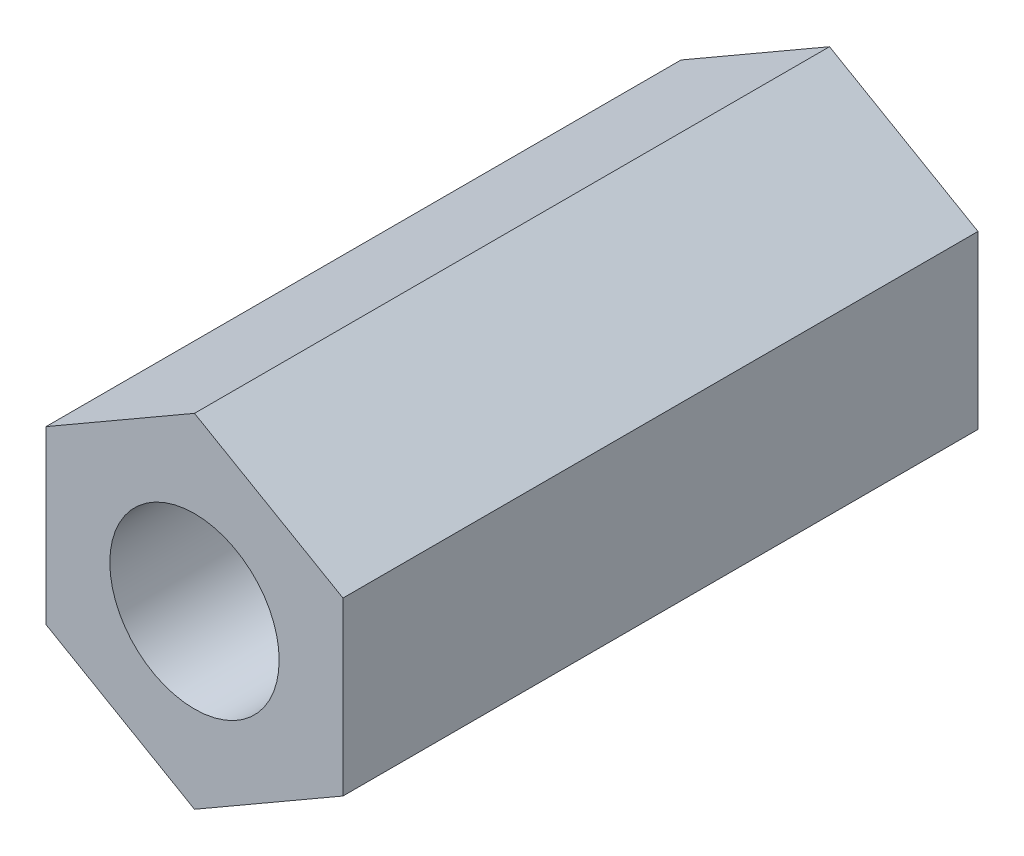
ISO-10303-21;
HEADER;
FILE_DESCRIPTION(('STEP AP214'),'2;1');
FILE_NAME('part.step','',(''),(''),'','','');
FILE_SCHEMA(('AUTOMOTIVE_DESIGN { 1 0 10303 214 1 1 1 1 }'));
ENDSEC;
DATA;
#1=APPLICATION_CONTEXT('core data for automotive mechanical design processes');
#2=APPLICATION_PROTOCOL_DEFINITION('international standard','automotive_design',2000,#1);
#3=PRODUCT_CONTEXT('',#1,'mechanical');
#4=PRODUCT('Part','Part','',(#3));
#5=PRODUCT_RELATED_PRODUCT_CATEGORY('part','',(#4));
#6=PRODUCT_DEFINITION_FORMATION('','',#4);
#7=PRODUCT_DEFINITION_CONTEXT('part definition',#1,'design');
#8=PRODUCT_DEFINITION('design','',#6,#7);
#9=PRODUCT_DEFINITION_SHAPE('','',#8);
#10=(LENGTH_UNIT() NAMED_UNIT(*) SI_UNIT(.MILLI.,.METRE.));
#11=(NAMED_UNIT(*) PLANE_ANGLE_UNIT() SI_UNIT($,.RADIAN.));
#12=(NAMED_UNIT(*) SI_UNIT($,.STERADIAN.) SOLID_ANGLE_UNIT());
#13=UNCERTAINTY_MEASURE_WITH_UNIT(LENGTH_MEASURE(1.E-05),#10,'distance_accuracy_value','');
#14=(GEOMETRIC_REPRESENTATION_CONTEXT(3) GLOBAL_UNCERTAINTY_ASSIGNED_CONTEXT((#13)) GLOBAL_UNIT_ASSIGNED_CONTEXT((#10,
#11,#12)) REPRESENTATION_CONTEXT('',''));
#15=CARTESIAN_POINT('',(0.,0.,0.));
#16=DIRECTION('',(0.,0.,1.));
#17=DIRECTION('',(1.,0.,0.));
#18=AXIS2_PLACEMENT_3D('',#15,#16,#17);
#19=CARTESIAN_POINT('',(1.75370144266349,3.0375,15.));
#20=DIRECTION('',(-0.5,-0.866025403784439,0.));
#21=DIRECTION('',(0.866025403784439,-0.5,0.));
#22=AXIS2_PLACEMENT_3D('',#19,#20,#21);
#23=PLANE('',#22);
#24=DIRECTION('',(-0.866025403784439,0.5,0.));
#25=VECTOR('',#24,1.);
#26=CARTESIAN_POINT('',(1.75370144266349,3.0375,0.));
#27=LINE('',#26,#25);
#28=CARTESIAN_POINT('',(3.50740288532697,2.025,0.));
#29=VERTEX_POINT('',#28);
#30=CARTESIAN_POINT('',(0.,4.05,0.));
#31=VERTEX_POINT('',#30);
#32=EDGE_CURVE('E131',#29,#31,#27,.T.);
#33=ORIENTED_EDGE('',*,*,#32,.T.);
#34=DIRECTION('',(0.,0.,-1.));
#35=VECTOR('',#34,1.);
#36=CARTESIAN_POINT('',(0.,4.05,15.));
#37=LINE('',#36,#35);
#38=CARTESIAN_POINT('',(0.,4.05,15.));
#39=VERTEX_POINT('',#38);
#40=EDGE_CURVE('E11',#39,#31,#37,.T.);
#41=ORIENTED_EDGE('',*,*,#40,.F.);
#42=DIRECTION('',(-0.866025403784439,0.5,0.));
#43=VECTOR('',#42,1.);
#44=CARTESIAN_POINT('',(1.75370144266349,3.0375,15.));
#45=LINE('',#44,#43);
#46=CARTESIAN_POINT('',(3.50740288532697,2.025,15.));
#47=VERTEX_POINT('',#46);
#48=EDGE_CURVE('E144',#47,#39,#45,.T.);
#49=ORIENTED_EDGE('',*,*,#48,.F.);
#50=DIRECTION('',(0.,0.,-1.));
#51=VECTOR('',#50,1.);
#52=CARTESIAN_POINT('',(3.50740288532697,2.025,15.));
#53=LINE('',#52,#51);
#54=EDGE_CURVE('E130',#47,#29,#53,.T.);
#55=ORIENTED_EDGE('',*,*,#54,.T.);
#56=EDGE_LOOP('',(#33,#41,#49,#55));
#57=FACE_BOUND('',#56,.T.);
#58=ADVANCED_FACE('F43',(#57),#23,.F.);
#59=CARTESIAN_POINT('',(-1.75370144266348,3.0375,15.));
#60=DIRECTION('',(0.499999999999999,-0.866025403784439,0.));
#61=DIRECTION('',(0.866025403784439,0.499999999999999,0.));
#62=AXIS2_PLACEMENT_3D('',#59,#60,#61);
#63=PLANE('',#62);
#64=DIRECTION('',(-0.86602540378444,-0.499999999999999,0.));
#65=VECTOR('',#64,1.);
#66=CARTESIAN_POINT('',(-1.75370144266348,3.0375,0.));
#67=LINE('',#66,#65);
#68=CARTESIAN_POINT('',(-3.50740288532698,2.025,0.));
#69=VERTEX_POINT('',#68);
#70=EDGE_CURVE('E134',#31,#69,#67,.T.);
#71=ORIENTED_EDGE('',*,*,#70,.T.);
#72=DIRECTION('',(0.,0.,-1.));
#73=VECTOR('',#72,1.);
#74=CARTESIAN_POINT('',(-3.50740288532698,2.025,15.));
#75=LINE('',#74,#73);
#76=CARTESIAN_POINT('',(-3.50740288532698,2.025,15.));
#77=VERTEX_POINT('',#76);
#78=EDGE_CURVE('E51',#77,#69,#75,.T.);
#79=ORIENTED_EDGE('',*,*,#78,.F.);
#80=DIRECTION('',(-0.86602540378444,-0.499999999999999,0.));
#81=VECTOR('',#80,1.);
#82=CARTESIAN_POINT('',(-1.75370144266348,3.0375,15.));
#83=LINE('',#82,#81);
#84=EDGE_CURVE('E96',#39,#77,#83,.T.);
#85=ORIENTED_EDGE('',*,*,#84,.F.);
#86=ORIENTED_EDGE('',*,*,#40,.T.);
#87=EDGE_LOOP('',(#71,#79,#85,#86));
#88=FACE_BOUND('',#87,.T.);
#89=ADVANCED_FACE('F170',(#88),#63,.F.);
#90=CARTESIAN_POINT('',(-3.50740288532698,0.,15.));
#91=DIRECTION('',(1.,0.,0.));
#92=DIRECTION('',(0.,0.,-1.));
#93=AXIS2_PLACEMENT_3D('',#90,#91,#92);
#94=PLANE('',#93);
#95=DIRECTION('',(0.,-1.,0.));
#96=VECTOR('',#95,1.);
#97=CARTESIAN_POINT('',(-3.50740288532698,0.,0.));
#98=LINE('',#97,#96);
#99=CARTESIAN_POINT('',(-3.50740288532698,-2.025,0.));
#100=VERTEX_POINT('',#99);
#101=EDGE_CURVE('E136',#69,#100,#98,.T.);
#102=ORIENTED_EDGE('',*,*,#101,.T.);
#103=DIRECTION('',(0.,0.,-1.));
#104=VECTOR('',#103,1.);
#105=CARTESIAN_POINT('',(-3.50740288532698,-2.025,15.));
#106=LINE('',#105,#104);
#107=CARTESIAN_POINT('',(-3.50740288532698,-2.025,15.));
#108=VERTEX_POINT('',#107);
#109=EDGE_CURVE('E119',#108,#100,#106,.T.);
#110=ORIENTED_EDGE('',*,*,#109,.F.);
#111=DIRECTION('',(0.,-1.,0.));
#112=VECTOR('',#111,1.);
#113=CARTESIAN_POINT('',(-3.50740288532698,0.,15.));
#114=LINE('',#113,#112);
#115=EDGE_CURVE('E110',#77,#108,#114,.T.);
#116=ORIENTED_EDGE('',*,*,#115,.F.);
#117=ORIENTED_EDGE('',*,*,#78,.T.);
#118=EDGE_LOOP('',(#102,#110,#116,#117));
#119=FACE_BOUND('',#118,.T.);
#120=ADVANCED_FACE('F150',(#119),#94,.F.);
#121=CARTESIAN_POINT('',(-1.75370144266348,-3.0375,15.));
#122=DIRECTION('',(0.499999999999999,0.866025403784439,0.));
#123=DIRECTION('',(-0.866025403784439,0.499999999999999,0.));
#124=AXIS2_PLACEMENT_3D('',#121,#122,#123);
#125=PLANE('',#124);
#126=DIRECTION('',(0.866025403784439,-0.499999999999999,0.));
#127=VECTOR('',#126,1.);
#128=CARTESIAN_POINT('',(-1.75370144266348,-3.0375,0.));
#129=LINE('',#128,#127);
#130=CARTESIAN_POINT('',(0.,-4.05,0.));
#131=VERTEX_POINT('',#130);
#132=EDGE_CURVE('E118',#100,#131,#129,.T.);
#133=ORIENTED_EDGE('',*,*,#132,.T.);
#134=DIRECTION('',(0.,0.,-1.));
#135=VECTOR('',#134,1.);
#136=CARTESIAN_POINT('',(0.,-4.05,15.));
#137=LINE('',#136,#135);
#138=CARTESIAN_POINT('',(0.,-4.05,15.));
#139=VERTEX_POINT('',#138);
#140=EDGE_CURVE('E115',#139,#131,#137,.T.);
#141=ORIENTED_EDGE('',*,*,#140,.F.);
#142=DIRECTION('',(0.866025403784439,-0.499999999999999,0.));
#143=VECTOR('',#142,1.);
#144=CARTESIAN_POINT('',(-1.75370144266348,-3.0375,15.));
#145=LINE('',#144,#143);
#146=EDGE_CURVE('E103',#108,#139,#145,.T.);
#147=ORIENTED_EDGE('',*,*,#146,.F.);
#148=ORIENTED_EDGE('',*,*,#109,.T.);
#149=EDGE_LOOP('',(#133,#141,#147,#148));
#150=FACE_BOUND('',#149,.T.);
#151=ADVANCED_FACE('F116',(#150),#125,.F.);
#152=CARTESIAN_POINT('',(1.75370144266349,-3.03750000000001,15.));
#153=DIRECTION('',(-0.499999999999999,0.866025403784439,0.));
#154=DIRECTION('',(-0.866025403784439,-0.499999999999999,0.));
#155=AXIS2_PLACEMENT_3D('',#152,#153,#154);
#156=PLANE('',#155);
#157=DIRECTION('',(0.866025403784439,0.499999999999999,0.));
#158=VECTOR('',#157,1.);
#159=CARTESIAN_POINT('',(1.75370144266349,-3.03750000000001,0.));
#160=LINE('',#159,#158);
#161=CARTESIAN_POINT('',(3.50740288532697,-2.02500000000001,0.));
#162=VERTEX_POINT('',#161);
#163=EDGE_CURVE('E82',#131,#162,#160,.T.);
#164=ORIENTED_EDGE('',*,*,#163,.T.);
#165=DIRECTION('',(0.,0.,-1.));
#166=VECTOR('',#165,1.);
#167=CARTESIAN_POINT('',(3.50740288532697,-2.02500000000001,15.));
#168=LINE('',#167,#166);
#169=CARTESIAN_POINT('',(3.50740288532697,-2.02500000000001,15.));
#170=VERTEX_POINT('',#169);
#171=EDGE_CURVE('E120',#170,#162,#168,.T.);
#172=ORIENTED_EDGE('',*,*,#171,.F.);
#173=DIRECTION('',(0.866025403784439,0.499999999999999,0.));
#174=VECTOR('',#173,1.);
#175=CARTESIAN_POINT('',(1.75370144266349,-3.03750000000001,15.));
#176=LINE('',#175,#174);
#177=EDGE_CURVE('E108',#139,#170,#176,.T.);
#178=ORIENTED_EDGE('',*,*,#177,.F.);
#179=ORIENTED_EDGE('',*,*,#140,.T.);
#180=EDGE_LOOP('',(#164,#172,#178,#179));
#181=FACE_BOUND('',#180,.T.);
#182=ADVANCED_FACE('F122',(#181),#156,.F.);
#183=CARTESIAN_POINT('',(3.50740288532697,0.,15.));
#184=DIRECTION('',(-1.,0.,0.));
#185=DIRECTION('',(0.,0.,1.));
#186=AXIS2_PLACEMENT_3D('',#183,#184,#185);
#187=PLANE('',#186);
#188=DIRECTION('',(0.,1.,0.));
#189=VECTOR('',#188,1.);
#190=CARTESIAN_POINT('',(3.50740288532697,0.,0.));
#191=LINE('',#190,#189);
#192=EDGE_CURVE('E88',#162,#29,#191,.T.);
#193=ORIENTED_EDGE('',*,*,#192,.T.);
#194=ORIENTED_EDGE('',*,*,#54,.F.);
#195=DIRECTION('',(0.,1.,0.));
#196=VECTOR('',#195,1.);
#197=CARTESIAN_POINT('',(3.50740288532697,0.,15.));
#198=LINE('',#197,#196);
#199=EDGE_CURVE('E59',#170,#47,#198,.T.);
#200=ORIENTED_EDGE('',*,*,#199,.F.);
#201=ORIENTED_EDGE('',*,*,#171,.T.);
#202=EDGE_LOOP('',(#193,#194,#200,#201));
#203=FACE_BOUND('',#202,.T.);
#204=ADVANCED_FACE('F158',(#203),#187,.F.);
#205=CARTESIAN_POINT('',(0.,0.,15.));
#206=DIRECTION('',(0.,0.,-1.));
#207=DIRECTION('',(-1.,0.,0.));
#208=AXIS2_PLACEMENT_3D('',#205,#206,#207);
#209=CYLINDRICAL_SURFACE('',#208,2.);
#210=CARTESIAN_POINT('',(0.,0.,15.));
#211=DIRECTION('',(0.,0.,1.));
#212=DIRECTION('',(1.,0.,0.));
#213=AXIS2_PLACEMENT_3D('',#210,#211,#212);
#214=CIRCLE('',#213,2.);
#215=CARTESIAN_POINT('',(2.,0.,15.));
#216=VERTEX_POINT('',#215);
#217=EDGE_CURVE('E124',#216,#216,#214,.T.);
#218=ORIENTED_EDGE('',*,*,#217,.T.);
#219=EDGE_LOOP('',(#218));
#220=FACE_BOUND('',#219,.T.);
#221=CARTESIAN_POINT('',(0.,0.,0.));
#222=DIRECTION('',(0.,0.,1.));
#223=DIRECTION('',(1.,0.,0.));
#224=AXIS2_PLACEMENT_3D('',#221,#222,#223);
#225=CIRCLE('',#224,2.);
#226=CARTESIAN_POINT('',(2.,0.,0.));
#227=VERTEX_POINT('',#226);
#228=EDGE_CURVE('E141',#227,#227,#225,.T.);
#229=ORIENTED_EDGE('',*,*,#228,.F.);
#230=EDGE_LOOP('',(#229));
#231=FACE_BOUND('',#230,.T.);
#232=ADVANCED_FACE('F160',(#220,#231),#209,.F.);
#233=CARTESIAN_POINT('',(0.,0.,15.));
#234=DIRECTION('',(0.,0.,1.));
#235=DIRECTION('',(1.,0.,0.));
#236=AXIS2_PLACEMENT_3D('',#233,#234,#235);
#237=PLANE('',#236);
#238=ORIENTED_EDGE('',*,*,#48,.T.);
#239=ORIENTED_EDGE('',*,*,#84,.T.);
#240=ORIENTED_EDGE('',*,*,#115,.T.);
#241=ORIENTED_EDGE('',*,*,#146,.T.);
#242=ORIENTED_EDGE('',*,*,#177,.T.);
#243=ORIENTED_EDGE('',*,*,#199,.T.);
#244=EDGE_LOOP('',(#238,#239,#240,#241,#242,#243));
#245=FACE_BOUND('',#244,.T.);
#246=ORIENTED_EDGE('',*,*,#217,.F.);
#247=EDGE_LOOP('',(#246));
#248=FACE_BOUND('',#247,.T.);
#249=ADVANCED_FACE('F105',(#245,#248),#237,.T.);
#250=CARTESIAN_POINT('',(0.,0.,0.));
#251=DIRECTION('',(0.,0.,1.));
#252=DIRECTION('',(1.,0.,0.));
#253=AXIS2_PLACEMENT_3D('',#250,#251,#252);
#254=PLANE('',#253);
#255=ORIENTED_EDGE('',*,*,#32,.F.);
#256=ORIENTED_EDGE('',*,*,#192,.F.);
#257=ORIENTED_EDGE('',*,*,#163,.F.);
#258=ORIENTED_EDGE('',*,*,#132,.F.);
#259=ORIENTED_EDGE('',*,*,#101,.F.);
#260=ORIENTED_EDGE('',*,*,#70,.F.);
#261=EDGE_LOOP('',(#255,#256,#257,#258,#259,#260));
#262=FACE_BOUND('',#261,.T.);
#263=ORIENTED_EDGE('',*,*,#228,.T.);
#264=EDGE_LOOP('',(#263));
#265=FACE_BOUND('',#264,.T.);
#266=ADVANCED_FACE('F153',(#262,#265),#254,.F.);
#267=CLOSED_SHELL('',(#58,#89,#120,#151,#182,#204,#232,#249,#266));
#268=MANIFOLD_SOLID_BREP('B2',#267);
#269=ADVANCED_BREP_SHAPE_REPRESENTATION('',(#18,#268),#14);
#270=SHAPE_DEFINITION_REPRESENTATION(#9,#269);
ENDSEC;
END-ISO-10303-21;
